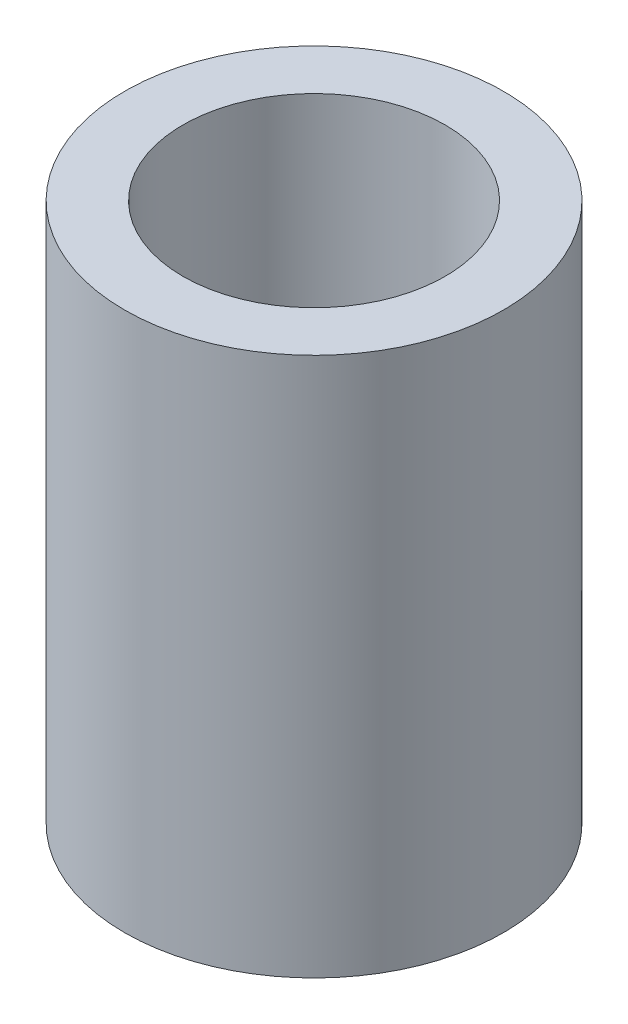
ISO-10303-21;
HEADER;
FILE_DESCRIPTION(('STEP AP214'),'2;1');
FILE_NAME('part.step','',(''),(''),'','','');
FILE_SCHEMA(('AUTOMOTIVE_DESIGN { 1 0 10303 214 1 1 1 1 }'));
ENDSEC;
DATA;
#1=APPLICATION_CONTEXT('core data for automotive mechanical design processes');
#2=APPLICATION_PROTOCOL_DEFINITION('international standard','automotive_design',2000,#1);
#3=PRODUCT_CONTEXT('',#1,'mechanical');
#4=PRODUCT('Part','Part','',(#3));
#5=PRODUCT_RELATED_PRODUCT_CATEGORY('part','',(#4));
#6=PRODUCT_DEFINITION_FORMATION('','',#4);
#7=PRODUCT_DEFINITION_CONTEXT('part definition',#1,'design');
#8=PRODUCT_DEFINITION('design','',#6,#7);
#9=PRODUCT_DEFINITION_SHAPE('','',#8);
#10=(LENGTH_UNIT() NAMED_UNIT(*) SI_UNIT(.MILLI.,.METRE.));
#11=(NAMED_UNIT(*) PLANE_ANGLE_UNIT() SI_UNIT($,.RADIAN.));
#12=(NAMED_UNIT(*) SI_UNIT($,.STERADIAN.) SOLID_ANGLE_UNIT());
#13=UNCERTAINTY_MEASURE_WITH_UNIT(LENGTH_MEASURE(1.E-05),#10,'distance_accuracy_value','');
#14=(GEOMETRIC_REPRESENTATION_CONTEXT(3) GLOBAL_UNCERTAINTY_ASSIGNED_CONTEXT((#13)) GLOBAL_UNIT_ASSIGNED_CONTEXT((#10,
#11,#12)) REPRESENTATION_CONTEXT('',''));
#15=CARTESIAN_POINT('',(0.,0.,0.));
#16=DIRECTION('',(0.,0.,1.));
#17=DIRECTION('',(1.,0.,0.));
#18=AXIS2_PLACEMENT_3D('',#15,#16,#17);
#19=CARTESIAN_POINT('',(0.,18.5,0.));
#20=DIRECTION('',(0.,1.,0.));
#21=DIRECTION('',(0.,0.,1.));
#22=AXIS2_PLACEMENT_3D('',#19,#20,#21);
#23=PLANE('',#22);
#24=CARTESIAN_POINT('',(0.,18.5,0.));
#25=DIRECTION('',(0.,1.,0.));
#26=DIRECTION('',(0.,0.,1.));
#27=AXIS2_PLACEMENT_3D('',#24,#25,#26);
#28=CIRCLE('',#27,6.5);
#29=CARTESIAN_POINT('',(0.,18.5,6.5));
#30=VERTEX_POINT('',#29);
#31=EDGE_CURVE('E10',#30,#30,#28,.T.);
#32=ORIENTED_EDGE('',*,*,#31,.T.);
#33=EDGE_LOOP('',(#32));
#34=FACE_BOUND('',#33,.T.);
#35=CARTESIAN_POINT('',(0.,18.5,0.));
#36=DIRECTION('',(0.,1.,0.));
#37=DIRECTION('',(0.,0.,1.));
#38=AXIS2_PLACEMENT_3D('',#35,#36,#37);
#39=CIRCLE('',#38,4.5);
#40=CARTESIAN_POINT('',(0.,18.5,4.5));
#41=VERTEX_POINT('',#40);
#42=EDGE_CURVE('E42',#41,#41,#39,.T.);
#43=ORIENTED_EDGE('',*,*,#42,.F.);
#44=EDGE_LOOP('',(#43));
#45=FACE_BOUND('',#44,.T.);
#46=ADVANCED_FACE('F31',(#34,#45),#23,.T.);
#47=CARTESIAN_POINT('',(0.,0.,0.));
#48=DIRECTION('',(0.,1.,0.));
#49=DIRECTION('',(0.,0.,1.));
#50=AXIS2_PLACEMENT_3D('',#47,#48,#49);
#51=PLANE('',#50);
#52=CARTESIAN_POINT('',(0.,0.,0.));
#53=DIRECTION('',(0.,1.,0.));
#54=DIRECTION('',(0.,0.,1.));
#55=AXIS2_PLACEMENT_3D('',#52,#53,#54);
#56=CIRCLE('',#55,6.5);
#57=CARTESIAN_POINT('',(0.,0.,6.5));
#58=VERTEX_POINT('',#57);
#59=EDGE_CURVE('E35',#58,#58,#56,.T.);
#60=ORIENTED_EDGE('',*,*,#59,.F.);
#61=EDGE_LOOP('',(#60));
#62=FACE_BOUND('',#61,.T.);
#63=CARTESIAN_POINT('',(0.,0.,0.));
#64=DIRECTION('',(0.,1.,0.));
#65=DIRECTION('',(0.,0.,1.));
#66=AXIS2_PLACEMENT_3D('',#63,#64,#65);
#67=CIRCLE('',#66,4.5);
#68=CARTESIAN_POINT('',(0.,0.,4.5));
#69=VERTEX_POINT('',#68);
#70=EDGE_CURVE('E44',#69,#69,#67,.T.);
#71=ORIENTED_EDGE('',*,*,#70,.T.);
#72=EDGE_LOOP('',(#71));
#73=FACE_BOUND('',#72,.T.);
#74=ADVANCED_FACE('F54',(#62,#73),#51,.F.);
#75=CARTESIAN_POINT('',(0.,18.5,0.));
#76=DIRECTION('',(0.,-1.,0.));
#77=DIRECTION('',(0.,0.,-1.));
#78=AXIS2_PLACEMENT_3D('',#75,#76,#77);
#79=CYLINDRICAL_SURFACE('',#78,6.5);
#80=ORIENTED_EDGE('',*,*,#31,.F.);
#81=EDGE_LOOP('',(#80));
#82=FACE_BOUND('',#81,.T.);
#83=ORIENTED_EDGE('',*,*,#59,.T.);
#84=EDGE_LOOP('',(#83));
#85=FACE_BOUND('',#84,.T.);
#86=ADVANCED_FACE('F33',(#82,#85),#79,.T.);
#87=CARTESIAN_POINT('',(0.,18.5,0.));
#88=DIRECTION('',(0.,-1.,0.));
#89=DIRECTION('',(0.,0.,-1.));
#90=AXIS2_PLACEMENT_3D('',#87,#88,#89);
#91=CYLINDRICAL_SURFACE('',#90,4.5);
#92=ORIENTED_EDGE('',*,*,#42,.T.);
#93=EDGE_LOOP('',(#92));
#94=FACE_BOUND('',#93,.T.);
#95=ORIENTED_EDGE('',*,*,#70,.F.);
#96=EDGE_LOOP('',(#95));
#97=FACE_BOUND('',#96,.T.);
#98=ADVANCED_FACE('F50',(#94,#97),#91,.F.);
#99=CLOSED_SHELL('',(#46,#74,#86,#98));
#100=MANIFOLD_SOLID_BREP('B2',#99);
#101=ADVANCED_BREP_SHAPE_REPRESENTATION('',(#18,#100),#14);
#102=SHAPE_DEFINITION_REPRESENTATION(#9,#101);
ENDSEC;
END-ISO-10303-21;
